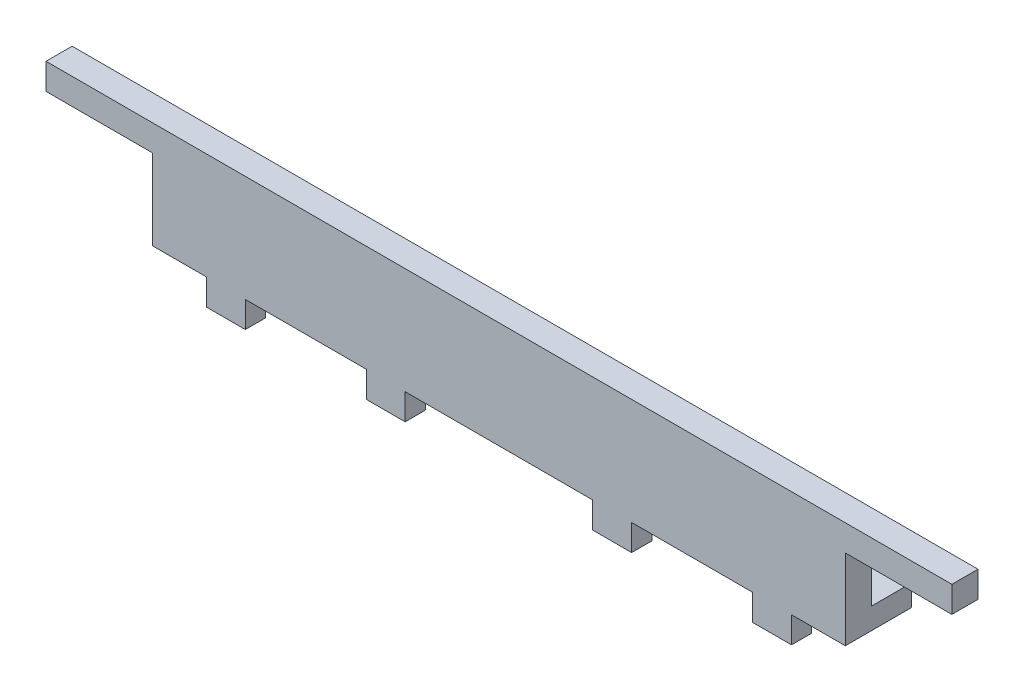
ISO-10303-21;
HEADER;
FILE_DESCRIPTION(('STEP AP214'),'2;1');
FILE_NAME('part.step','',(''),(''),'','','');
FILE_SCHEMA(('AUTOMOTIVE_DESIGN { 1 0 10303 214 1 1 1 1 }'));
ENDSEC;
DATA;
#1=APPLICATION_CONTEXT('core data for automotive mechanical design processes');
#2=APPLICATION_PROTOCOL_DEFINITION('international standard','automotive_design',2000,#1);
#3=PRODUCT_CONTEXT('',#1,'mechanical');
#4=PRODUCT('Part','Part','',(#3));
#5=PRODUCT_RELATED_PRODUCT_CATEGORY('part','',(#4));
#6=PRODUCT_DEFINITION_FORMATION('','',#4);
#7=PRODUCT_DEFINITION_CONTEXT('part definition',#1,'design');
#8=PRODUCT_DEFINITION('design','',#6,#7);
#9=PRODUCT_DEFINITION_SHAPE('','',#8);
#10=(LENGTH_UNIT() NAMED_UNIT(*) SI_UNIT(.MILLI.,.METRE.));
#11=(NAMED_UNIT(*) PLANE_ANGLE_UNIT() SI_UNIT($,.RADIAN.));
#12=(NAMED_UNIT(*) SI_UNIT($,.STERADIAN.) SOLID_ANGLE_UNIT());
#13=UNCERTAINTY_MEASURE_WITH_UNIT(LENGTH_MEASURE(1.E-05),#10,'distance_accuracy_value','');
#14=(GEOMETRIC_REPRESENTATION_CONTEXT(3) GLOBAL_UNCERTAINTY_ASSIGNED_CONTEXT((#13)) GLOBAL_UNIT_ASSIGNED_CONTEXT((#10,
#11,#12)) REPRESENTATION_CONTEXT('',''));
#15=CARTESIAN_POINT('',(0.,0.,0.));
#16=DIRECTION('',(0.,0.,1.));
#17=DIRECTION('',(1.,0.,0.));
#18=AXIS2_PLACEMENT_3D('',#15,#16,#17);
#19=CARTESIAN_POINT('',(-57.5838926174496,11.2639821029083,4.9));
#20=DIRECTION('',(0.,1.,0.));
#21=DIRECTION('',(0.,0.,1.));
#22=AXIS2_PLACEMENT_3D('',#19,#20,#21);
#23=PLANE('',#22);
#24=DIRECTION('',(-1.,0.,0.));
#25=VECTOR('',#24,1.);
#26=CARTESIAN_POINT('',(-47.4838926174496,11.2639821029082,1.1));
#27=LINE('',#26,#25);
#28=CARTESIAN_POINT('',(-40.1838926174496,11.2639821029082,1.1));
#29=VERTEX_POINT('',#28);
#30=CARTESIAN_POINT('',(-47.4838926174496,11.2639821029082,1.1));
#31=VERTEX_POINT('',#30);
#32=EDGE_CURVE('E250',#29,#31,#27,.T.);
#33=ORIENTED_EDGE('',*,*,#32,.T.);
#34=DIRECTION('',(0.,0.,1.));
#35=VECTOR('',#34,1.);
#36=CARTESIAN_POINT('',(-47.4838926174496,11.2639821029082,4.9));
#37=LINE('',#36,#35);
#38=CARTESIAN_POINT('',(-47.4838926174496,11.2639821029082,4.9));
#39=VERTEX_POINT('',#38);
#40=EDGE_CURVE('E220',#31,#39,#37,.T.);
#41=ORIENTED_EDGE('',*,*,#40,.T.);
#42=DIRECTION('',(1.,0.,0.));
#43=VECTOR('',#42,1.);
#44=CARTESIAN_POINT('',(-57.5838926174496,11.2639821029083,4.9));
#45=LINE('',#44,#43);
#46=CARTESIAN_POINT('',(-57.5838926174496,11.2639821029083,4.9));
#47=VERTEX_POINT('',#46);
#48=EDGE_CURVE('E464',#47,#39,#45,.T.);
#49=ORIENTED_EDGE('',*,*,#48,.F.);
#50=DIRECTION('',(0.,0.,-1.));
#51=VECTOR('',#50,1.);
#52=CARTESIAN_POINT('',(-57.5838926174496,11.2639821029083,4.9));
#53=LINE('',#52,#51);
#54=CARTESIAN_POINT('',(-57.5838926174496,11.2639821029083,-7.5));
#55=VERTEX_POINT('',#54);
#56=EDGE_CURVE('E11',#47,#55,#53,.T.);
#57=ORIENTED_EDGE('',*,*,#56,.T.);
#58=DIRECTION('',(-1.,0.,0.));
#59=VECTOR('',#58,1.);
#60=CARTESIAN_POINT('',(72.4161073825504,11.2639821029083,-7.5));
#61=LINE('',#60,#59);
#62=CARTESIAN_POINT('',(72.4161073825504,11.2639821029083,-7.5));
#63=VERTEX_POINT('',#62);
#64=EDGE_CURVE('E384',#63,#55,#61,.T.);
#65=ORIENTED_EDGE('',*,*,#64,.F.);
#66=DIRECTION('',(0.,0.,-1.));
#67=VECTOR('',#66,1.);
#68=CARTESIAN_POINT('',(72.4161073825504,11.2639821029083,4.9));
#69=LINE('',#68,#67);
#70=CARTESIAN_POINT('',(72.4161073825504,11.2639821029083,4.9));
#71=VERTEX_POINT('',#70);
#72=EDGE_CURVE('E48',#71,#63,#69,.T.);
#73=ORIENTED_EDGE('',*,*,#72,.F.);
#74=CARTESIAN_POINT('',(62.3161073825504,11.2639821029083,4.9));
#75=VERTEX_POINT('',#74);
#76=EDGE_CURVE('E462',#75,#71,#45,.T.);
#77=ORIENTED_EDGE('',*,*,#76,.F.);
#78=DIRECTION('',(0.,0.,1.));
#79=VECTOR('',#78,1.);
#80=CARTESIAN_POINT('',(62.3161073825504,11.2639821029083,4.9));
#81=LINE('',#80,#79);
#82=CARTESIAN_POINT('',(62.3161073825504,11.2639821029083,1.1));
#83=VERTEX_POINT('',#82);
#84=EDGE_CURVE('E63',#83,#75,#81,.T.);
#85=ORIENTED_EDGE('',*,*,#84,.F.);
#86=DIRECTION('',(1.,0.,0.));
#87=VECTOR('',#86,1.);
#88=CARTESIAN_POINT('',(62.3161073825504,11.2639821029083,1.1));
#89=LINE('',#88,#87);
#90=CARTESIAN_POINT('',(55.0161073825504,11.2639821029083,1.1));
#91=VERTEX_POINT('',#90);
#92=EDGE_CURVE('E267',#91,#83,#89,.T.);
#93=ORIENTED_EDGE('',*,*,#92,.F.);
#94=DIRECTION('',(0.,0.,-1.));
#95=VECTOR('',#94,1.);
#96=CARTESIAN_POINT('',(55.0161073825504,11.2639821029083,4.9));
#97=LINE('',#96,#95);
#98=CARTESIAN_POINT('',(55.0161073825504,11.2639821029083,4.9));
#99=VERTEX_POINT('',#98);
#100=EDGE_CURVE('E279',#99,#91,#97,.T.);
#101=ORIENTED_EDGE('',*,*,#100,.F.);
#102=CARTESIAN_POINT('',(32.3161073825504,11.2639821029083,4.9));
#103=VERTEX_POINT('',#102);
#104=EDGE_CURVE('E470',#103,#99,#45,.T.);
#105=ORIENTED_EDGE('',*,*,#104,.F.);
#106=DIRECTION('',(0.,0.,1.));
#107=VECTOR('',#106,1.);
#108=CARTESIAN_POINT('',(32.3161073825504,11.2639821029083,4.9));
#109=LINE('',#108,#107);
#110=CARTESIAN_POINT('',(32.3161073825504,11.2639821029083,1.1));
#111=VERTEX_POINT('',#110);
#112=EDGE_CURVE('E338',#111,#103,#109,.T.);
#113=ORIENTED_EDGE('',*,*,#112,.F.);
#114=DIRECTION('',(1.,0.,0.));
#115=VECTOR('',#114,1.);
#116=CARTESIAN_POINT('',(32.3161073825504,11.2639821029083,1.1));
#117=LINE('',#116,#115);
#118=CARTESIAN_POINT('',(25.0161073825504,11.2639821029083,1.1));
#119=VERTEX_POINT('',#118);
#120=EDGE_CURVE('E344',#119,#111,#117,.T.);
#121=ORIENTED_EDGE('',*,*,#120,.F.);
#122=DIRECTION('',(0.,0.,-1.));
#123=VECTOR('',#122,1.);
#124=CARTESIAN_POINT('',(25.0161073825504,11.2639821029083,4.9));
#125=LINE('',#124,#123);
#126=CARTESIAN_POINT('',(25.0161073825504,11.2639821029083,4.9));
#127=VERTEX_POINT('',#126);
#128=EDGE_CURVE('E357',#127,#119,#125,.T.);
#129=ORIENTED_EDGE('',*,*,#128,.F.);
#130=CARTESIAN_POINT('',(-10.1838926174496,11.2639821029083,4.9));
#131=VERTEX_POINT('',#130);
#132=EDGE_CURVE('E821',#131,#127,#45,.T.);
#133=ORIENTED_EDGE('',*,*,#132,.F.);
#134=DIRECTION('',(0.,0.,-1.));
#135=VECTOR('',#134,1.);
#136=CARTESIAN_POINT('',(-10.1838926174496,11.2639821029082,4.9));
#137=LINE('',#136,#135);
#138=CARTESIAN_POINT('',(-10.1838926174496,11.2639821029082,1.1));
#139=VERTEX_POINT('',#138);
#140=EDGE_CURVE('E302',#131,#139,#137,.T.);
#141=ORIENTED_EDGE('',*,*,#140,.T.);
#142=DIRECTION('',(-1.,0.,0.));
#143=VECTOR('',#142,1.);
#144=CARTESIAN_POINT('',(-17.4838926174496,11.2639821029082,1.1));
#145=LINE('',#144,#143);
#146=CARTESIAN_POINT('',(-17.4838926174496,11.2639821029082,1.1));
#147=VERTEX_POINT('',#146);
#148=EDGE_CURVE('E318',#139,#147,#145,.T.);
#149=ORIENTED_EDGE('',*,*,#148,.T.);
#150=DIRECTION('',(0.,0.,1.));
#151=VECTOR('',#150,1.);
#152=CARTESIAN_POINT('',(-17.4838926174496,11.2639821029082,4.9));
#153=LINE('',#152,#151);
#154=CARTESIAN_POINT('',(-17.4838926174496,11.2639821029082,4.9));
#155=VERTEX_POINT('',#154);
#156=EDGE_CURVE('E296',#147,#155,#153,.T.);
#157=ORIENTED_EDGE('',*,*,#156,.T.);
#158=CARTESIAN_POINT('',(-40.1838926174496,11.2639821029083,4.9));
#159=VERTEX_POINT('',#158);
#160=EDGE_CURVE('E469',#159,#155,#45,.T.);
#161=ORIENTED_EDGE('',*,*,#160,.F.);
#162=DIRECTION('',(0.,0.,-1.));
#163=VECTOR('',#162,1.);
#164=CARTESIAN_POINT('',(-40.1838926174496,11.2639821029082,4.9));
#165=LINE('',#164,#163);
#166=EDGE_CURVE('E55',#159,#29,#165,.T.);
#167=ORIENTED_EDGE('',*,*,#166,.T.);
#168=EDGE_LOOP('',(#33,#41,#49,#57,#65,#73,#77,#85,#93,#101,#105,#113,#121,#129,#133,#141,#149,
#157,#161,#167));
#169=FACE_BOUND('',#168,.T.);
#170=ADVANCED_FACE('F39',(#169),#23,.F.);
#171=CARTESIAN_POINT('',(0.,0.,0.));
#172=DIRECTION('',(0.,0.,1.));
#173=DIRECTION('',(1.,0.,0.));
#174=AXIS2_PLACEMENT_3D('',#171,#172,#173);
#175=PLANE('',#174);
#176=DIRECTION('',(1.,0.,0.));
#177=VECTOR('',#176,1.);
#178=CARTESIAN_POINT('',(72.4161073825504,15.2639821029083,0.));
#179=LINE('',#178,#177);
#180=CARTESIAN_POINT('',(-57.5838926174496,15.2639821029083,0.));
#181=VERTEX_POINT('',#180);
#182=CARTESIAN_POINT('',(72.4161073825504,15.2639821029083,0.));
#183=VERTEX_POINT('',#182);
#184=EDGE_CURVE('E379',#181,#183,#179,.T.);
#185=ORIENTED_EDGE('',*,*,#184,.F.);
#186=DIRECTION('',(0.,-1.,0.));
#187=VECTOR('',#186,1.);
#188=CARTESIAN_POINT('',(-57.5838926174496,31.2639821029083,0.));
#189=LINE('',#188,#187);
#190=CARTESIAN_POINT('',(-57.5838926174496,26.3639821029082,0.));
#191=VERTEX_POINT('',#190);
#192=EDGE_CURVE('E458',#191,#181,#189,.T.);
#193=ORIENTED_EDGE('',*,*,#192,.F.);
#194=DIRECTION('',(1.,0.,0.));
#195=VECTOR('',#194,1.);
#196=CARTESIAN_POINT('',(-77.5838926174496,26.3639821029081,0.));
#197=LINE('',#196,#195);
#198=CARTESIAN_POINT('',(-77.5838926174496,26.3639821029081,0.));
#199=VERTEX_POINT('',#198);
#200=EDGE_CURVE('E428',#199,#191,#197,.T.);
#201=ORIENTED_EDGE('',*,*,#200,.F.);
#202=DIRECTION('',(0.,1.,0.));
#203=VECTOR('',#202,1.);
#204=CARTESIAN_POINT('',(-77.5838926174496,31.2639821029082,0.));
#205=LINE('',#204,#203);
#206=CARTESIAN_POINT('',(-77.5838926174496,31.2639821029082,0.));
#207=VERTEX_POINT('',#206);
#208=EDGE_CURVE('E414',#199,#207,#205,.T.);
#209=ORIENTED_EDGE('',*,*,#208,.T.);
#210=DIRECTION('',(-1.,0.,0.));
#211=VECTOR('',#210,1.);
#212=CARTESIAN_POINT('',(-57.5838926174496,31.2639821029083,0.));
#213=LINE('',#212,#211);
#214=CARTESIAN_POINT('',(92.4161073825504,31.2639821029083,0.));
#215=VERTEX_POINT('',#214);
#216=EDGE_CURVE('E463',#215,#207,#213,.T.);
#217=ORIENTED_EDGE('',*,*,#216,.F.);
#218=DIRECTION('',(0.,1.,0.));
#219=VECTOR('',#218,1.);
#220=CARTESIAN_POINT('',(92.4161073825504,31.2639821029083,0.));
#221=LINE('',#220,#219);
#222=CARTESIAN_POINT('',(92.4161073825504,26.3639821029083,0.));
#223=VERTEX_POINT('',#222);
#224=EDGE_CURVE('E439',#223,#215,#221,.T.);
#225=ORIENTED_EDGE('',*,*,#224,.F.);
#226=DIRECTION('',(-1.,0.,0.));
#227=VECTOR('',#226,1.);
#228=CARTESIAN_POINT('',(92.4161073825504,26.3639821029083,0.));
#229=LINE('',#228,#227);
#230=CARTESIAN_POINT('',(72.4161073825504,26.3639821029083,0.));
#231=VERTEX_POINT('',#230);
#232=EDGE_CURVE('E447',#223,#231,#229,.T.);
#233=ORIENTED_EDGE('',*,*,#232,.T.);
#234=DIRECTION('',(0.,1.,0.));
#235=VECTOR('',#234,1.);
#236=CARTESIAN_POINT('',(72.4161073825504,31.2639821029083,0.));
#237=LINE('',#236,#235);
#238=EDGE_CURVE('E480',#183,#231,#237,.T.);
#239=ORIENTED_EDGE('',*,*,#238,.F.);
#240=EDGE_LOOP('',(#185,#193,#201,#209,#217,#225,#233,#239));
#241=FACE_BOUND('',#240,.T.);
#242=ADVANCED_FACE('F509',(#241),#175,.F.);
#243=CARTESIAN_POINT('',(72.4161073825504,31.2639821029083,4.9));
#244=DIRECTION('',(-1.,0.,0.));
#245=DIRECTION('',(0.,0.,1.));
#246=AXIS2_PLACEMENT_3D('',#243,#244,#245);
#247=PLANE('',#246);
#248=DIRECTION('',(0.,0.,-1.));
#249=VECTOR('',#248,1.);
#250=CARTESIAN_POINT('',(72.4161073825504,26.3639821029083,4.9));
#251=LINE('',#250,#249);
#252=CARTESIAN_POINT('',(72.4161073825504,26.3639821029083,4.9));
#253=VERTEX_POINT('',#252);
#254=EDGE_CURVE('E431',#253,#231,#251,.T.);
#255=ORIENTED_EDGE('',*,*,#254,.F.);
#256=DIRECTION('',(0.,1.,0.));
#257=VECTOR('',#256,1.);
#258=CARTESIAN_POINT('',(72.4161073825504,31.2639821029083,4.9));
#259=LINE('',#258,#257);
#260=EDGE_CURVE('E468',#71,#253,#259,.T.);
#261=ORIENTED_EDGE('',*,*,#260,.F.);
#262=ORIENTED_EDGE('',*,*,#72,.T.);
#263=DIRECTION('',(0.,-1.,0.));
#264=VECTOR('',#263,1.);
#265=CARTESIAN_POINT('',(72.4161073825504,11.2639821029083,-7.5));
#266=LINE('',#265,#264);
#267=CARTESIAN_POINT('',(72.4161073825504,15.2639821029083,-7.5));
#268=VERTEX_POINT('',#267);
#269=EDGE_CURVE('E380',#268,#63,#266,.T.);
#270=ORIENTED_EDGE('',*,*,#269,.F.);
#271=DIRECTION('',(0.,0.,1.));
#272=VECTOR('',#271,1.);
#273=CARTESIAN_POINT('',(72.4161073825504,15.2639821029083,-7.5));
#274=LINE('',#273,#272);
#275=EDGE_CURVE('E394',#268,#183,#274,.T.);
#276=ORIENTED_EDGE('',*,*,#275,.T.);
#277=ORIENTED_EDGE('',*,*,#238,.T.);
#278=EDGE_LOOP('',(#255,#261,#262,#270,#276,#277));
#279=FACE_BOUND('',#278,.T.);
#280=ADVANCED_FACE('F490',(#279),#247,.F.);
#281=CARTESIAN_POINT('',(-57.5838926174496,31.2639821029083,4.9));
#282=DIRECTION('',(1.,0.,0.));
#283=DIRECTION('',(0.,1.,0.));
#284=AXIS2_PLACEMENT_3D('',#281,#282,#283);
#285=PLANE('',#284);
#286=DIRECTION('',(0.,-1.,0.));
#287=VECTOR('',#286,1.);
#288=CARTESIAN_POINT('',(-57.5838926174496,31.2639821029083,4.9));
#289=LINE('',#288,#287);
#290=CARTESIAN_POINT('',(-57.5838926174496,26.3639821029082,4.9));
#291=VERTEX_POINT('',#290);
#292=EDGE_CURVE('E459',#291,#47,#289,.T.);
#293=ORIENTED_EDGE('',*,*,#292,.F.);
#294=DIRECTION('',(0.,0.,-1.));
#295=VECTOR('',#294,1.);
#296=CARTESIAN_POINT('',(-57.5838926174496,26.3639821029082,4.9));
#297=LINE('',#296,#295);
#298=EDGE_CURVE('E405',#291,#191,#297,.T.);
#299=ORIENTED_EDGE('',*,*,#298,.T.);
#300=ORIENTED_EDGE('',*,*,#192,.T.);
#301=DIRECTION('',(0.,0.,1.));
#302=VECTOR('',#301,1.);
#303=CARTESIAN_POINT('',(-57.5838926174496,15.2639821029083,-7.5));
#304=LINE('',#303,#302);
#305=CARTESIAN_POINT('',(-57.5838926174496,15.2639821029083,-7.5));
#306=VERTEX_POINT('',#305);
#307=EDGE_CURVE('E401',#306,#181,#304,.T.);
#308=ORIENTED_EDGE('',*,*,#307,.F.);
#309=DIRECTION('',(0.,1.,0.));
#310=VECTOR('',#309,1.);
#311=CARTESIAN_POINT('',(-57.5838926174496,11.2639821029083,-7.5));
#312=LINE('',#311,#310);
#313=EDGE_CURVE('E388',#55,#306,#312,.T.);
#314=ORIENTED_EDGE('',*,*,#313,.F.);
#315=ORIENTED_EDGE('',*,*,#56,.F.);
#316=EDGE_LOOP('',(#293,#299,#300,#308,#314,#315));
#317=FACE_BOUND('',#316,.T.);
#318=ADVANCED_FACE('F41',(#317),#285,.F.);
#319=CARTESIAN_POINT('',(-57.5838926174496,31.2639821029083,4.9));
#320=DIRECTION('',(0.,-1.,0.));
#321=DIRECTION('',(0.,0.,-1.));
#322=AXIS2_PLACEMENT_3D('',#319,#320,#321);
#323=PLANE('',#322);
#324=ORIENTED_EDGE('',*,*,#216,.T.);
#325=DIRECTION('',(0.,0.,1.));
#326=VECTOR('',#325,1.);
#327=CARTESIAN_POINT('',(-77.5838926174496,31.2639821029082,4.9));
#328=LINE('',#327,#326);
#329=CARTESIAN_POINT('',(-77.5838926174496,31.2639821029082,4.9));
#330=VERTEX_POINT('',#329);
#331=EDGE_CURVE('E410',#207,#330,#328,.T.);
#332=ORIENTED_EDGE('',*,*,#331,.T.);
#333=DIRECTION('',(-1.,0.,0.));
#334=VECTOR('',#333,1.);
#335=CARTESIAN_POINT('',(-57.5838926174496,31.2639821029083,4.9));
#336=LINE('',#335,#334);
#337=CARTESIAN_POINT('',(92.4161073825504,31.2639821029083,4.9));
#338=VERTEX_POINT('',#337);
#339=EDGE_CURVE('E474',#338,#330,#336,.T.);
#340=ORIENTED_EDGE('',*,*,#339,.F.);
#341=DIRECTION('',(0.,0.,1.));
#342=VECTOR('',#341,1.);
#343=CARTESIAN_POINT('',(92.4161073825504,31.2639821029083,4.9));
#344=LINE('',#343,#342);
#345=EDGE_CURVE('E443',#215,#338,#344,.T.);
#346=ORIENTED_EDGE('',*,*,#345,.F.);
#347=EDGE_LOOP('',(#324,#332,#340,#346));
#348=FACE_BOUND('',#347,.T.);
#349=ADVANCED_FACE('F515',(#348),#323,.F.);
#350=CARTESIAN_POINT('',(0.,0.,4.9));
#351=DIRECTION('',(0.,0.,1.));
#352=DIRECTION('',(1.,0.,0.));
#353=AXIS2_PLACEMENT_3D('',#350,#351,#352);
#354=PLANE('',#353);
#355=ORIENTED_EDGE('',*,*,#339,.T.);
#356=DIRECTION('',(0.,-1.,0.));
#357=VECTOR('',#356,1.);
#358=CARTESIAN_POINT('',(-77.5838926174496,31.2639821029082,4.9));
#359=LINE('',#358,#357);
#360=CARTESIAN_POINT('',(-77.5838926174496,26.3639821029081,4.9));
#361=VERTEX_POINT('',#360);
#362=EDGE_CURVE('E406',#330,#361,#359,.T.);
#363=ORIENTED_EDGE('',*,*,#362,.T.);
#364=DIRECTION('',(1.,0.,0.));
#365=VECTOR('',#364,1.);
#366=CARTESIAN_POINT('',(-77.5838926174496,26.3639821029081,4.9));
#367=LINE('',#366,#365);
#368=EDGE_CURVE('E422',#361,#291,#367,.T.);
#369=ORIENTED_EDGE('',*,*,#368,.T.);
#370=ORIENTED_EDGE('',*,*,#292,.T.);
#371=ORIENTED_EDGE('',*,*,#48,.T.);
#372=DIRECTION('',(0.,1.,0.));
#373=VECTOR('',#372,1.);
#374=CARTESIAN_POINT('',(-47.4838926174496,6.36398210290819,4.9));
#375=LINE('',#374,#373);
#376=CARTESIAN_POINT('',(-47.4838926174496,6.36398210290819,4.9));
#377=VERTEX_POINT('',#376);
#378=EDGE_CURVE('E247',#377,#39,#375,.T.);
#379=ORIENTED_EDGE('',*,*,#378,.F.);
#380=DIRECTION('',(1.,0.,0.));
#381=VECTOR('',#380,1.);
#382=CARTESIAN_POINT('',(-47.4838926174496,6.36398210290819,4.9));
#383=LINE('',#382,#381);
#384=CARTESIAN_POINT('',(-40.1838926174496,6.3639821029082,4.9));
#385=VERTEX_POINT('',#384);
#386=EDGE_CURVE('E235',#377,#385,#383,.T.);
#387=ORIENTED_EDGE('',*,*,#386,.T.);
#388=DIRECTION('',(0.,1.,0.));
#389=VECTOR('',#388,1.);
#390=CARTESIAN_POINT('',(-40.1838926174496,6.3639821029082,4.9));
#391=LINE('',#390,#389);
#392=EDGE_CURVE('E257',#385,#159,#391,.T.);
#393=ORIENTED_EDGE('',*,*,#392,.T.);
#394=ORIENTED_EDGE('',*,*,#160,.T.);
#395=DIRECTION('',(0.,1.,0.));
#396=VECTOR('',#395,1.);
#397=CARTESIAN_POINT('',(-17.4838926174496,6.36398210290823,4.9));
#398=LINE('',#397,#396);
#399=CARTESIAN_POINT('',(-17.4838926174496,6.36398210290823,4.9));
#400=VERTEX_POINT('',#399);
#401=EDGE_CURVE('E314',#400,#155,#398,.T.);
#402=ORIENTED_EDGE('',*,*,#401,.F.);
#403=DIRECTION('',(1.,0.,0.));
#404=VECTOR('',#403,1.);
#405=CARTESIAN_POINT('',(-17.4838926174496,6.36398210290823,4.9));
#406=LINE('',#405,#404);
#407=CARTESIAN_POINT('',(-10.1838926174496,6.36398210290824,4.9));
#408=VERTEX_POINT('',#407);
#409=EDGE_CURVE('E310',#400,#408,#406,.T.);
#410=ORIENTED_EDGE('',*,*,#409,.T.);
#411=DIRECTION('',(0.,1.,0.));
#412=VECTOR('',#411,1.);
#413=CARTESIAN_POINT('',(-10.1838926174496,6.36398210290824,4.9));
#414=LINE('',#413,#412);
#415=EDGE_CURVE('E328',#408,#131,#414,.T.);
#416=ORIENTED_EDGE('',*,*,#415,.T.);
#417=ORIENTED_EDGE('',*,*,#132,.T.);
#418=DIRECTION('',(0.,1.,0.));
#419=VECTOR('',#418,1.);
#420=CARTESIAN_POINT('',(25.0161073825504,6.36398210290827,4.9));
#421=LINE('',#420,#419);
#422=CARTESIAN_POINT('',(25.0161073825504,6.36398210290827,4.9));
#423=VERTEX_POINT('',#422);
#424=EDGE_CURVE('E371',#423,#127,#421,.T.);
#425=ORIENTED_EDGE('',*,*,#424,.F.);
#426=DIRECTION('',(-1.,0.,0.));
#427=VECTOR('',#426,1.);
#428=CARTESIAN_POINT('',(32.3161073825504,6.36398210290827,4.9));
#429=LINE('',#428,#427);
#430=CARTESIAN_POINT('',(32.3161073825504,6.36398210290827,4.9));
#431=VERTEX_POINT('',#430);
#432=EDGE_CURVE('E343',#431,#423,#429,.T.);
#433=ORIENTED_EDGE('',*,*,#432,.F.);
#434=DIRECTION('',(0.,1.,0.));
#435=VECTOR('',#434,1.);
#436=CARTESIAN_POINT('',(32.3161073825504,6.36398210290827,4.9));
#437=LINE('',#436,#435);
#438=EDGE_CURVE('E375',#431,#103,#437,.T.);
#439=ORIENTED_EDGE('',*,*,#438,.T.);
#440=ORIENTED_EDGE('',*,*,#104,.T.);
#441=DIRECTION('',(0.,1.,0.));
#442=VECTOR('',#441,1.);
#443=CARTESIAN_POINT('',(55.0161073825504,6.36398210290827,4.9));
#444=LINE('',#443,#442);
#445=CARTESIAN_POINT('',(55.0161073825504,6.36398210290827,4.9));
#446=VERTEX_POINT('',#445);
#447=EDGE_CURVE('E290',#446,#99,#444,.T.);
#448=ORIENTED_EDGE('',*,*,#447,.F.);
#449=DIRECTION('',(-1.,0.,0.));
#450=VECTOR('',#449,1.);
#451=CARTESIAN_POINT('',(62.3161073825504,6.36398210290827,4.9));
#452=LINE('',#451,#450);
#453=CARTESIAN_POINT('',(62.3161073825504,6.36398210290827,4.9));
#454=VERTEX_POINT('',#453);
#455=EDGE_CURVE('E266',#454,#446,#452,.T.);
#456=ORIENTED_EDGE('',*,*,#455,.F.);
#457=DIRECTION('',(0.,1.,0.));
#458=VECTOR('',#457,1.);
#459=CARTESIAN_POINT('',(62.3161073825504,6.36398210290827,4.9));
#460=LINE('',#459,#458);
#461=EDGE_CURVE('E293',#454,#75,#460,.T.);
#462=ORIENTED_EDGE('',*,*,#461,.T.);
#463=ORIENTED_EDGE('',*,*,#76,.T.);
#464=ORIENTED_EDGE('',*,*,#260,.T.);
#465=DIRECTION('',(-1.,0.,0.));
#466=VECTOR('',#465,1.);
#467=CARTESIAN_POINT('',(92.4161073825504,26.3639821029083,4.9));
#468=LINE('',#467,#466);
#469=CARTESIAN_POINT('',(92.4161073825504,26.3639821029083,4.9));
#470=VERTEX_POINT('',#469);
#471=EDGE_CURVE('E454',#470,#253,#468,.T.);
#472=ORIENTED_EDGE('',*,*,#471,.F.);
#473=DIRECTION('',(0.,-1.,0.));
#474=VECTOR('',#473,1.);
#475=CARTESIAN_POINT('',(92.4161073825504,31.2639821029083,4.9));
#476=LINE('',#475,#474);
#477=EDGE_CURVE('E432',#338,#470,#476,.T.);
#478=ORIENTED_EDGE('',*,*,#477,.F.);
#479=EDGE_LOOP('',(#355,#363,#369,#370,#371,#379,#387,#393,#394,#402,#410,#416,#417,#425,#433,
#439,#440,#448,#456,#462,#463,#464,#472,#478));
#480=FACE_BOUND('',#479,.T.);
#481=ADVANCED_FACE('F519',(#480),#354,.T.);
#482=CARTESIAN_POINT('',(92.4161073825504,26.3639821029083,4.9));
#483=DIRECTION('',(0.,1.,0.));
#484=DIRECTION('',(0.,0.,1.));
#485=AXIS2_PLACEMENT_3D('',#482,#483,#484);
#486=PLANE('',#485);
#487=ORIENTED_EDGE('',*,*,#254,.T.);
#488=ORIENTED_EDGE('',*,*,#232,.F.);
#489=DIRECTION('',(0.,0.,-1.));
#490=VECTOR('',#489,1.);
#491=CARTESIAN_POINT('',(92.4161073825504,26.3639821029083,4.9));
#492=LINE('',#491,#490);
#493=EDGE_CURVE('E436',#470,#223,#492,.T.);
#494=ORIENTED_EDGE('',*,*,#493,.F.);
#495=ORIENTED_EDGE('',*,*,#471,.T.);
#496=EDGE_LOOP('',(#487,#488,#494,#495));
#497=FACE_BOUND('',#496,.T.);
#498=ADVANCED_FACE('F506',(#497),#486,.F.);
#499=CARTESIAN_POINT('',(92.4161073825504,0.,0.));
#500=DIRECTION('',(1.,0.,0.));
#501=DIRECTION('',(0.,0.,-1.));
#502=AXIS2_PLACEMENT_3D('',#499,#500,#501);
#503=PLANE('',#502);
#504=ORIENTED_EDGE('',*,*,#477,.T.);
#505=ORIENTED_EDGE('',*,*,#493,.T.);
#506=ORIENTED_EDGE('',*,*,#224,.T.);
#507=ORIENTED_EDGE('',*,*,#345,.T.);
#508=EDGE_LOOP('',(#504,#505,#506,#507));
#509=FACE_BOUND('',#508,.T.);
#510=ADVANCED_FACE('F512',(#509),#503,.T.);
#511=CARTESIAN_POINT('',(-77.5838926174496,26.3639821029081,4.9));
#512=DIRECTION('',(0.,-1.,0.));
#513=DIRECTION('',(1.,0.,0.));
#514=AXIS2_PLACEMENT_3D('',#511,#512,#513);
#515=PLANE('',#514);
#516=ORIENTED_EDGE('',*,*,#298,.F.);
#517=ORIENTED_EDGE('',*,*,#368,.F.);
#518=DIRECTION('',(0.,0.,-1.));
#519=VECTOR('',#518,1.);
#520=CARTESIAN_POINT('',(-77.5838926174496,26.3639821029081,4.9));
#521=LINE('',#520,#519);
#522=EDGE_CURVE('E418',#361,#199,#521,.T.);
#523=ORIENTED_EDGE('',*,*,#522,.T.);
#524=ORIENTED_EDGE('',*,*,#200,.T.);
#525=EDGE_LOOP('',(#516,#517,#523,#524));
#526=FACE_BOUND('',#525,.T.);
#527=ADVANCED_FACE('F526',(#526),#515,.T.);
#528=CARTESIAN_POINT('',(-77.5838926174496,-1.17961196366423E-13,0.));
#529=DIRECTION('',(-1.,0.,0.));
#530=DIRECTION('',(0.,0.,-1.));
#531=AXIS2_PLACEMENT_3D('',#528,#529,#530);
#532=PLANE('',#531);
#533=ORIENTED_EDGE('',*,*,#362,.F.);
#534=ORIENTED_EDGE('',*,*,#331,.F.);
#535=ORIENTED_EDGE('',*,*,#208,.F.);
#536=ORIENTED_EDGE('',*,*,#522,.F.);
#537=EDGE_LOOP('',(#533,#534,#535,#536));
#538=FACE_BOUND('',#537,.T.);
#539=ADVANCED_FACE('F522',(#538),#532,.T.);
#540=CARTESIAN_POINT('',(72.4161073825504,15.2639821029083,-7.5));
#541=DIRECTION('',(0.,-1.,0.));
#542=DIRECTION('',(0.,0.,-1.));
#543=AXIS2_PLACEMENT_3D('',#540,#541,#542);
#544=PLANE('',#543);
#545=ORIENTED_EDGE('',*,*,#184,.T.);
#546=ORIENTED_EDGE('',*,*,#275,.F.);
#547=DIRECTION('',(1.,0.,0.));
#548=VECTOR('',#547,1.);
#549=CARTESIAN_POINT('',(72.4161073825504,15.2639821029083,-7.5));
#550=LINE('',#549,#548);
#551=EDGE_CURVE('E391',#306,#268,#550,.T.);
#552=ORIENTED_EDGE('',*,*,#551,.F.);
#553=ORIENTED_EDGE('',*,*,#307,.T.);
#554=EDGE_LOOP('',(#545,#546,#552,#553));
#555=FACE_BOUND('',#554,.T.);
#556=ADVANCED_FACE('F502',(#555),#544,.F.);
#557=CARTESIAN_POINT('',(0.,0.,-7.5));
#558=DIRECTION('',(0.,0.,1.));
#559=DIRECTION('',(1.,0.,0.));
#560=AXIS2_PLACEMENT_3D('',#557,#558,#559);
#561=PLANE('',#560);
#562=ORIENTED_EDGE('',*,*,#269,.T.);
#563=ORIENTED_EDGE('',*,*,#64,.T.);
#564=ORIENTED_EDGE('',*,*,#313,.T.);
#565=ORIENTED_EDGE('',*,*,#551,.T.);
#566=EDGE_LOOP('',(#562,#563,#564,#565));
#567=FACE_BOUND('',#566,.T.);
#568=ADVANCED_FACE('F497',(#567),#561,.F.);
#569=CARTESIAN_POINT('',(32.3161073825504,6.36398210290827,4.9));
#570=DIRECTION('',(-1.,0.,0.));
#571=DIRECTION('',(0.,0.,1.));
#572=AXIS2_PLACEMENT_3D('',#569,#570,#571);
#573=PLANE('',#572);
#574=ORIENTED_EDGE('',*,*,#112,.T.);
#575=ORIENTED_EDGE('',*,*,#438,.F.);
#576=DIRECTION('',(0.,0.,1.));
#577=VECTOR('',#576,1.);
#578=CARTESIAN_POINT('',(32.3161073825504,6.36398210290827,4.9));
#579=LINE('',#578,#577);
#580=CARTESIAN_POINT('',(32.3161073825504,6.36398210290827,1.1));
#581=VERTEX_POINT('',#580);
#582=EDGE_CURVE('E339',#581,#431,#579,.T.);
#583=ORIENTED_EDGE('',*,*,#582,.F.);
#584=DIRECTION('',(0.,1.,0.));
#585=VECTOR('',#584,1.);
#586=CARTESIAN_POINT('',(32.3161073825504,6.36398210290827,1.1));
#587=LINE('',#586,#585);
#588=EDGE_CURVE('E353',#581,#111,#587,.T.);
#589=ORIENTED_EDGE('',*,*,#588,.T.);
#590=EDGE_LOOP('',(#574,#575,#583,#589));
#591=FACE_BOUND('',#590,.T.);
#592=ADVANCED_FACE('F559',(#591),#573,.F.);
#593=CARTESIAN_POINT('',(25.0161073825504,6.36398210290827,4.9));
#594=DIRECTION('',(1.,0.,0.));
#595=DIRECTION('',(0.,0.,-1.));
#596=AXIS2_PLACEMENT_3D('',#593,#594,#595);
#597=PLANE('',#596);
#598=ORIENTED_EDGE('',*,*,#128,.T.);
#599=DIRECTION('',(0.,1.,0.));
#600=VECTOR('',#599,1.);
#601=CARTESIAN_POINT('',(25.0161073825504,6.36398210290827,1.1));
#602=LINE('',#601,#600);
#603=CARTESIAN_POINT('',(25.0161073825504,6.36398210290827,1.1));
#604=VERTEX_POINT('',#603);
#605=EDGE_CURVE('E367',#604,#119,#602,.T.);
#606=ORIENTED_EDGE('',*,*,#605,.F.);
#607=DIRECTION('',(0.,0.,-1.));
#608=VECTOR('',#607,1.);
#609=CARTESIAN_POINT('',(25.0161073825504,6.36398210290827,4.9));
#610=LINE('',#609,#608);
#611=EDGE_CURVE('E347',#423,#604,#610,.T.);
#612=ORIENTED_EDGE('',*,*,#611,.F.);
#613=ORIENTED_EDGE('',*,*,#424,.T.);
#614=EDGE_LOOP('',(#598,#606,#612,#613));
#615=FACE_BOUND('',#614,.T.);
#616=ADVANCED_FACE('F562',(#615),#597,.F.);
#617=CARTESIAN_POINT('',(32.3161073825504,6.36398210290827,1.1));
#618=DIRECTION('',(0.,0.,1.));
#619=DIRECTION('',(1.,0.,0.));
#620=AXIS2_PLACEMENT_3D('',#617,#618,#619);
#621=PLANE('',#620);
#622=ORIENTED_EDGE('',*,*,#120,.T.);
#623=ORIENTED_EDGE('',*,*,#588,.F.);
#624=DIRECTION('',(1.,0.,0.));
#625=VECTOR('',#624,1.);
#626=CARTESIAN_POINT('',(32.3161073825504,6.36398210290827,1.1));
#627=LINE('',#626,#625);
#628=EDGE_CURVE('E350',#604,#581,#627,.T.);
#629=ORIENTED_EDGE('',*,*,#628,.F.);
#630=ORIENTED_EDGE('',*,*,#605,.T.);
#631=EDGE_LOOP('',(#622,#623,#629,#630));
#632=FACE_BOUND('',#631,.T.);
#633=ADVANCED_FACE('F566',(#632),#621,.F.);
#634=CARTESIAN_POINT('',(0.,6.36398210290827,0.));
#635=DIRECTION('',(0.,1.,0.));
#636=DIRECTION('',(0.,0.,1.));
#637=AXIS2_PLACEMENT_3D('',#634,#635,#636);
#638=PLANE('',#637);
#639=ORIENTED_EDGE('',*,*,#582,.T.);
#640=ORIENTED_EDGE('',*,*,#432,.T.);
#641=ORIENTED_EDGE('',*,*,#611,.T.);
#642=ORIENTED_EDGE('',*,*,#628,.T.);
#643=EDGE_LOOP('',(#639,#640,#641,#642));
#644=FACE_BOUND('',#643,.T.);
#645=ADVANCED_FACE('F570',(#644),#638,.F.);
#646=CARTESIAN_POINT('',(-17.4838926174496,6.36398210290823,4.9));
#647=DIRECTION('',(-1.,0.,0.));
#648=DIRECTION('',(0.,0.,1.));
#649=AXIS2_PLACEMENT_3D('',#646,#647,#648);
#650=PLANE('',#649);
#651=ORIENTED_EDGE('',*,*,#156,.F.);
#652=DIRECTION('',(0.,1.,0.));
#653=VECTOR('',#652,1.);
#654=CARTESIAN_POINT('',(-17.4838926174496,6.36398210290823,1.1));
#655=LINE('',#654,#653);
#656=CARTESIAN_POINT('',(-17.4838926174496,6.36398210290823,1.1));
#657=VERTEX_POINT('',#656);
#658=EDGE_CURVE('E335',#657,#147,#655,.T.);
#659=ORIENTED_EDGE('',*,*,#658,.F.);
#660=DIRECTION('',(0.,0.,1.));
#661=VECTOR('',#660,1.);
#662=CARTESIAN_POINT('',(-17.4838926174496,6.36398210290823,4.9));
#663=LINE('',#662,#661);
#664=EDGE_CURVE('E297',#657,#400,#663,.T.);
#665=ORIENTED_EDGE('',*,*,#664,.T.);
#666=ORIENTED_EDGE('',*,*,#401,.T.);
#667=EDGE_LOOP('',(#651,#659,#665,#666));
#668=FACE_BOUND('',#667,.T.);
#669=ADVANCED_FACE('F574',(#668),#650,.T.);
#670=CARTESIAN_POINT('',(-17.4838926174496,6.36398210290823,1.1));
#671=DIRECTION('',(0.,0.,-1.));
#672=DIRECTION('',(-1.,0.,0.));
#673=AXIS2_PLACEMENT_3D('',#670,#671,#672);
#674=PLANE('',#673);
#675=ORIENTED_EDGE('',*,*,#148,.F.);
#676=DIRECTION('',(0.,1.,0.));
#677=VECTOR('',#676,1.);
#678=CARTESIAN_POINT('',(-10.1838926174496,6.36398210290824,1.1));
#679=LINE('',#678,#677);
#680=CARTESIAN_POINT('',(-10.1838926174496,6.36398210290824,1.1));
#681=VERTEX_POINT('',#680);
#682=EDGE_CURVE('E332',#681,#139,#679,.T.);
#683=ORIENTED_EDGE('',*,*,#682,.F.);
#684=DIRECTION('',(-1.,0.,0.));
#685=VECTOR('',#684,1.);
#686=CARTESIAN_POINT('',(-17.4838926174496,6.36398210290823,1.1));
#687=LINE('',#686,#685);
#688=EDGE_CURVE('E301',#681,#657,#687,.T.);
#689=ORIENTED_EDGE('',*,*,#688,.T.);
#690=ORIENTED_EDGE('',*,*,#658,.T.);
#691=EDGE_LOOP('',(#675,#683,#689,#690));
#692=FACE_BOUND('',#691,.T.);
#693=ADVANCED_FACE('F578',(#692),#674,.T.);
#694=CARTESIAN_POINT('',(-10.1838926174496,6.36398210290824,4.9));
#695=DIRECTION('',(1.,0.,0.));
#696=DIRECTION('',(0.,1.,0.));
#697=AXIS2_PLACEMENT_3D('',#694,#695,#696);
#698=PLANE('',#697);
#699=ORIENTED_EDGE('',*,*,#140,.F.);
#700=ORIENTED_EDGE('',*,*,#415,.F.);
#701=DIRECTION('',(0.,0.,-1.));
#702=VECTOR('',#701,1.);
#703=CARTESIAN_POINT('',(-10.1838926174496,6.36398210290824,4.9));
#704=LINE('',#703,#702);
#705=EDGE_CURVE('E306',#408,#681,#704,.T.);
#706=ORIENTED_EDGE('',*,*,#705,.T.);
#707=ORIENTED_EDGE('',*,*,#682,.T.);
#708=EDGE_LOOP('',(#699,#700,#706,#707));
#709=FACE_BOUND('',#708,.T.);
#710=ADVANCED_FACE('F582',(#709),#698,.T.);
#711=CARTESIAN_POINT('',(14.8322147651008,6.36398210290828,0.));
#712=DIRECTION('',(0.,1.,0.));
#713=DIRECTION('',(0.,0.,1.));
#714=AXIS2_PLACEMENT_3D('',#711,#712,#713);
#715=PLANE('',#714);
#716=ORIENTED_EDGE('',*,*,#664,.F.);
#717=ORIENTED_EDGE('',*,*,#688,.F.);
#718=ORIENTED_EDGE('',*,*,#705,.F.);
#719=ORIENTED_EDGE('',*,*,#409,.F.);
#720=EDGE_LOOP('',(#716,#717,#718,#719));
#721=FACE_BOUND('',#720,.T.);
#722=ADVANCED_FACE('F586',(#721),#715,.F.);
#723=CARTESIAN_POINT('',(62.3161073825504,6.36398210290827,4.9));
#724=DIRECTION('',(-1.,0.,0.));
#725=DIRECTION('',(0.,0.,1.));
#726=AXIS2_PLACEMENT_3D('',#723,#724,#725);
#727=PLANE('',#726);
#728=ORIENTED_EDGE('',*,*,#84,.T.);
#729=ORIENTED_EDGE('',*,*,#461,.F.);
#730=DIRECTION('',(0.,0.,1.));
#731=VECTOR('',#730,1.);
#732=CARTESIAN_POINT('',(62.3161073825504,6.36398210290827,4.9));
#733=LINE('',#732,#731);
#734=CARTESIAN_POINT('',(62.3161073825504,6.36398210290827,1.1));
#735=VERTEX_POINT('',#734);
#736=EDGE_CURVE('E262',#735,#454,#733,.T.);
#737=ORIENTED_EDGE('',*,*,#736,.F.);
#738=DIRECTION('',(0.,1.,0.));
#739=VECTOR('',#738,1.);
#740=CARTESIAN_POINT('',(62.3161073825504,6.36398210290827,1.1));
#741=LINE('',#740,#739);
#742=EDGE_CURVE('E276',#735,#83,#741,.T.);
#743=ORIENTED_EDGE('',*,*,#742,.T.);
#744=EDGE_LOOP('',(#728,#729,#737,#743));
#745=FACE_BOUND('',#744,.T.);
#746=ADVANCED_FACE('F590',(#745),#727,.F.);
#747=CARTESIAN_POINT('',(55.0161073825504,6.36398210290827,4.9));
#748=DIRECTION('',(1.,0.,0.));
#749=DIRECTION('',(0.,0.,-1.));
#750=AXIS2_PLACEMENT_3D('',#747,#748,#749);
#751=PLANE('',#750);
#752=ORIENTED_EDGE('',*,*,#100,.T.);
#753=DIRECTION('',(0.,1.,0.));
#754=VECTOR('',#753,1.);
#755=CARTESIAN_POINT('',(55.0161073825504,6.36398210290827,1.1));
#756=LINE('',#755,#754);
#757=CARTESIAN_POINT('',(55.0161073825504,6.36398210290827,1.1));
#758=VERTEX_POINT('',#757);
#759=EDGE_CURVE('E286',#758,#91,#756,.T.);
#760=ORIENTED_EDGE('',*,*,#759,.F.);
#761=DIRECTION('',(0.,0.,-1.));
#762=VECTOR('',#761,1.);
#763=CARTESIAN_POINT('',(55.0161073825504,6.36398210290827,4.9));
#764=LINE('',#763,#762);
#765=EDGE_CURVE('E270',#446,#758,#764,.T.);
#766=ORIENTED_EDGE('',*,*,#765,.F.);
#767=ORIENTED_EDGE('',*,*,#447,.T.);
#768=EDGE_LOOP('',(#752,#760,#766,#767));
#769=FACE_BOUND('',#768,.T.);
#770=ADVANCED_FACE('F594',(#769),#751,.F.);
#771=CARTESIAN_POINT('',(62.3161073825504,6.36398210290827,1.1));
#772=DIRECTION('',(0.,0.,1.));
#773=DIRECTION('',(1.,0.,0.));
#774=AXIS2_PLACEMENT_3D('',#771,#772,#773);
#775=PLANE('',#774);
#776=ORIENTED_EDGE('',*,*,#92,.T.);
#777=ORIENTED_EDGE('',*,*,#742,.F.);
#778=DIRECTION('',(1.,0.,0.));
#779=VECTOR('',#778,1.);
#780=CARTESIAN_POINT('',(62.3161073825504,6.36398210290827,1.1));
#781=LINE('',#780,#779);
#782=EDGE_CURVE('E273',#758,#735,#781,.T.);
#783=ORIENTED_EDGE('',*,*,#782,.F.);
#784=ORIENTED_EDGE('',*,*,#759,.T.);
#785=EDGE_LOOP('',(#776,#777,#783,#784));
#786=FACE_BOUND('',#785,.T.);
#787=ADVANCED_FACE('F597',(#786),#775,.F.);
#788=CARTESIAN_POINT('',(0.,6.36398210290827,0.));
#789=DIRECTION('',(0.,1.,0.));
#790=DIRECTION('',(0.,0.,1.));
#791=AXIS2_PLACEMENT_3D('',#788,#789,#790);
#792=PLANE('',#791);
#793=ORIENTED_EDGE('',*,*,#736,.T.);
#794=ORIENTED_EDGE('',*,*,#455,.T.);
#795=ORIENTED_EDGE('',*,*,#765,.T.);
#796=ORIENTED_EDGE('',*,*,#782,.T.);
#797=EDGE_LOOP('',(#793,#794,#795,#796));
#798=FACE_BOUND('',#797,.T.);
#799=ADVANCED_FACE('F601',(#798),#792,.F.);
#800=CARTESIAN_POINT('',(-47.4838926174496,6.36398210290819,4.9));
#801=DIRECTION('',(-1.,0.,0.));
#802=DIRECTION('',(0.,-1.,0.));
#803=AXIS2_PLACEMENT_3D('',#800,#801,#802);
#804=PLANE('',#803);
#805=ORIENTED_EDGE('',*,*,#40,.F.);
#806=DIRECTION('',(0.,1.,0.));
#807=VECTOR('',#806,1.);
#808=CARTESIAN_POINT('',(-47.4838926174496,6.36398210290819,1.1));
#809=LINE('',#808,#807);
#810=CARTESIAN_POINT('',(-47.4838926174496,6.36398210290819,1.1));
#811=VERTEX_POINT('',#810);
#812=EDGE_CURVE('E214',#811,#31,#809,.T.);
#813=ORIENTED_EDGE('',*,*,#812,.F.);
#814=DIRECTION('',(0.,0.,1.));
#815=VECTOR('',#814,1.);
#816=CARTESIAN_POINT('',(-47.4838926174496,6.36398210290819,4.9));
#817=LINE('',#816,#815);
#818=EDGE_CURVE('E217',#811,#377,#817,.T.);
#819=ORIENTED_EDGE('',*,*,#818,.T.);
#820=ORIENTED_EDGE('',*,*,#378,.T.);
#821=EDGE_LOOP('',(#805,#813,#819,#820));
#822=FACE_BOUND('',#821,.T.);
#823=ADVANCED_FACE('F216',(#822),#804,.T.);
#824=CARTESIAN_POINT('',(-47.4838926174496,6.36398210290819,1.1));
#825=DIRECTION('',(0.,0.,-1.));
#826=DIRECTION('',(-1.,0.,0.));
#827=AXIS2_PLACEMENT_3D('',#824,#825,#826);
#828=PLANE('',#827);
#829=ORIENTED_EDGE('',*,*,#32,.F.);
#830=DIRECTION('',(0.,1.,0.));
#831=VECTOR('',#830,1.);
#832=CARTESIAN_POINT('',(-40.1838926174496,6.3639821029082,1.1));
#833=LINE('',#832,#831);
#834=CARTESIAN_POINT('',(-40.1838926174496,6.3639821029082,1.1));
#835=VERTEX_POINT('',#834);
#836=EDGE_CURVE('E226',#835,#29,#833,.T.);
#837=ORIENTED_EDGE('',*,*,#836,.F.);
#838=DIRECTION('',(-1.,0.,0.));
#839=VECTOR('',#838,1.);
#840=CARTESIAN_POINT('',(-47.4838926174496,6.36398210290819,1.1));
#841=LINE('',#840,#839);
#842=EDGE_CURVE('E232',#835,#811,#841,.T.);
#843=ORIENTED_EDGE('',*,*,#842,.T.);
#844=ORIENTED_EDGE('',*,*,#812,.T.);
#845=EDGE_LOOP('',(#829,#837,#843,#844));
#846=FACE_BOUND('',#845,.T.);
#847=ADVANCED_FACE('F238',(#846),#828,.T.);
#848=CARTESIAN_POINT('',(-40.1838926174496,6.3639821029082,4.9));
#849=DIRECTION('',(1.,0.,0.));
#850=DIRECTION('',(0.,1.,0.));
#851=AXIS2_PLACEMENT_3D('',#848,#849,#850);
#852=PLANE('',#851);
#853=ORIENTED_EDGE('',*,*,#166,.F.);
#854=ORIENTED_EDGE('',*,*,#392,.F.);
#855=DIRECTION('',(0.,0.,-1.));
#856=VECTOR('',#855,1.);
#857=CARTESIAN_POINT('',(-40.1838926174496,6.3639821029082,4.9));
#858=LINE('',#857,#856);
#859=EDGE_CURVE('E240',#385,#835,#858,.T.);
#860=ORIENTED_EDGE('',*,*,#859,.T.);
#861=ORIENTED_EDGE('',*,*,#836,.T.);
#862=EDGE_LOOP('',(#853,#854,#860,#861));
#863=FACE_BOUND('',#862,.T.);
#864=ADVANCED_FACE('F610',(#863),#852,.T.);
#865=CARTESIAN_POINT('',(14.8322147651008,6.36398210290828,0.));
#866=DIRECTION('',(0.,1.,0.));
#867=DIRECTION('',(0.,0.,1.));
#868=AXIS2_PLACEMENT_3D('',#865,#866,#867);
#869=PLANE('',#868);
#870=ORIENTED_EDGE('',*,*,#818,.F.);
#871=ORIENTED_EDGE('',*,*,#842,.F.);
#872=ORIENTED_EDGE('',*,*,#859,.F.);
#873=ORIENTED_EDGE('',*,*,#386,.F.);
#874=EDGE_LOOP('',(#870,#871,#872,#873));
#875=FACE_BOUND('',#874,.T.);
#876=ADVANCED_FACE('F230',(#875),#869,.F.);
#877=CLOSED_SHELL('',(#170,#242,#280,#318,#349,#481,#498,#510,#527,#539,#556,#568,#592,#616,
#633,#645,#669,#693,#710,#722,#746,#770,#787,#799,#823,#847,#864,#876));
#878=MANIFOLD_SOLID_BREP('B2',#877);
#879=ADVANCED_BREP_SHAPE_REPRESENTATION('',(#18,#878),#14);
#880=SHAPE_DEFINITION_REPRESENTATION(#9,#879);
ENDSEC;
END-ISO-10303-21;
